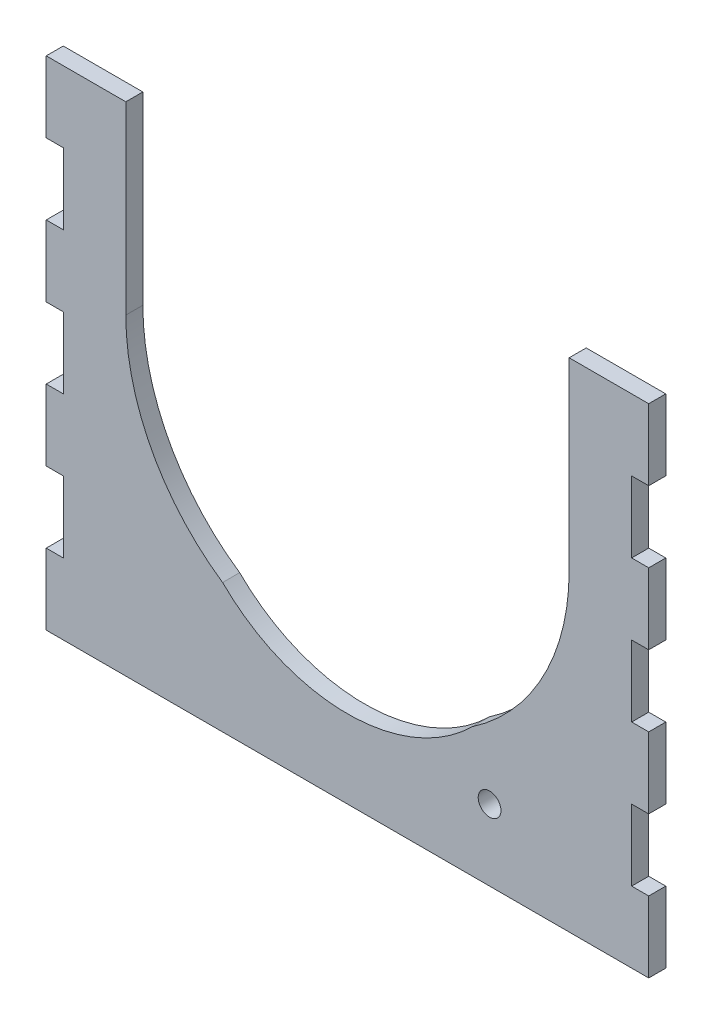
ISO-10303-21;
HEADER;
FILE_DESCRIPTION(('STEP AP214'),'2;1');
FILE_NAME('part.step','',(''),(''),'','','');
FILE_SCHEMA(('AUTOMOTIVE_DESIGN { 1 0 10303 214 1 1 1 1 }'));
ENDSEC;
DATA;
#1=APPLICATION_CONTEXT('core data for automotive mechanical design processes');
#2=APPLICATION_PROTOCOL_DEFINITION('international standard','automotive_design',2000,#1);
#3=PRODUCT_CONTEXT('',#1,'mechanical');
#4=PRODUCT('Part','Part','',(#3));
#5=PRODUCT_RELATED_PRODUCT_CATEGORY('part','',(#4));
#6=PRODUCT_DEFINITION_FORMATION('','',#4);
#7=PRODUCT_DEFINITION_CONTEXT('part definition',#1,'design');
#8=PRODUCT_DEFINITION('design','',#6,#7);
#9=PRODUCT_DEFINITION_SHAPE('','',#8);
#10=(LENGTH_UNIT() NAMED_UNIT(*) SI_UNIT(.MILLI.,.METRE.));
#11=(NAMED_UNIT(*) PLANE_ANGLE_UNIT() SI_UNIT($,.RADIAN.));
#12=(NAMED_UNIT(*) SI_UNIT($,.STERADIAN.) SOLID_ANGLE_UNIT());
#13=UNCERTAINTY_MEASURE_WITH_UNIT(LENGTH_MEASURE(1.E-05),#10,'distance_accuracy_value','');
#14=(GEOMETRIC_REPRESENTATION_CONTEXT(3) GLOBAL_UNCERTAINTY_ASSIGNED_CONTEXT((#13)) GLOBAL_UNIT_ASSIGNED_CONTEXT((#10,
#11,#12)) REPRESENTATION_CONTEXT('',''));
#15=CARTESIAN_POINT('',(0.,0.,0.));
#16=DIRECTION('',(0.,0.,1.));
#17=DIRECTION('',(1.,0.,0.));
#18=AXIS2_PLACEMENT_3D('',#15,#16,#17);
#19=CARTESIAN_POINT('',(0.,0.,6.));
#20=DIRECTION('',(-1.,0.,0.));
#21=DIRECTION('',(0.,0.,1.));
#22=AXIS2_PLACEMENT_3D('',#19,#20,#21);
#23=PLANE('',#22);
#24=DIRECTION('',(0.,1.,0.));
#25=VECTOR('',#24,1.);
#26=CARTESIAN_POINT('',(0.,0.,6.));
#27=LINE('',#26,#25);
#28=CARTESIAN_POINT('',(0.,24.9999999999999,6.));
#29=VERTEX_POINT('',#28);
#30=CARTESIAN_POINT('',(0.,50.,6.));
#31=VERTEX_POINT('',#30);
#32=EDGE_CURVE('E61',#29,#31,#27,.T.);
#33=ORIENTED_EDGE('',*,*,#32,.F.);
#34=DIRECTION('',(0.,0.,1.));
#35=VECTOR('',#34,1.);
#36=CARTESIAN_POINT('',(0.,24.9999999999999,0.));
#37=LINE('',#36,#35);
#38=CARTESIAN_POINT('',(0.,24.9999999999999,0.));
#39=VERTEX_POINT('',#38);
#40=EDGE_CURVE('E279',#39,#29,#37,.T.);
#41=ORIENTED_EDGE('',*,*,#40,.F.);
#42=DIRECTION('',(0.,1.,0.));
#43=VECTOR('',#42,1.);
#44=CARTESIAN_POINT('',(0.,0.,0.));
#45=LINE('',#44,#43);
#46=CARTESIAN_POINT('',(0.,50.,0.));
#47=VERTEX_POINT('',#46);
#48=EDGE_CURVE('E286',#39,#47,#45,.T.);
#49=ORIENTED_EDGE('',*,*,#48,.T.);
#50=DIRECTION('',(0.,0.,1.));
#51=VECTOR('',#50,1.);
#52=CARTESIAN_POINT('',(0.,50.,0.));
#53=LINE('',#52,#51);
#54=EDGE_CURVE('E363',#47,#31,#53,.T.);
#55=ORIENTED_EDGE('',*,*,#54,.T.);
#56=EDGE_LOOP('',(#33,#41,#49,#55));
#57=FACE_BOUND('',#56,.T.);
#58=ADVANCED_FACE('F45',(#57),#23,.F.);
#59=CARTESIAN_POINT('',(-200.,0.,6.));
#60=DIRECTION('',(1.,0.,0.));
#61=DIRECTION('',(0.,1.,0.));
#62=AXIS2_PLACEMENT_3D('',#59,#60,#61);
#63=PLANE('',#62);
#64=DIRECTION('',(0.,-1.,0.));
#65=VECTOR('',#64,1.);
#66=CARTESIAN_POINT('',(-200.,0.,0.));
#67=LINE('',#66,#65);
#68=CARTESIAN_POINT('',(-200.,50.,0.));
#69=VERTEX_POINT('',#68);
#70=CARTESIAN_POINT('',(-200.,24.9999999999999,0.));
#71=VERTEX_POINT('',#70);
#72=EDGE_CURVE('E597',#69,#71,#67,.T.);
#73=ORIENTED_EDGE('',*,*,#72,.T.);
#74=DIRECTION('',(0.,0.,1.));
#75=VECTOR('',#74,1.);
#76=CARTESIAN_POINT('',(-200.,24.9999999999999,0.));
#77=LINE('',#76,#75);
#78=CARTESIAN_POINT('',(-200.,24.9999999999999,6.));
#79=VERTEX_POINT('',#78);
#80=EDGE_CURVE('E69',#71,#79,#77,.T.);
#81=ORIENTED_EDGE('',*,*,#80,.T.);
#82=DIRECTION('',(0.,-1.,0.));
#83=VECTOR('',#82,1.);
#84=CARTESIAN_POINT('',(-200.,0.,6.));
#85=LINE('',#84,#83);
#86=CARTESIAN_POINT('',(-200.,50.,6.));
#87=VERTEX_POINT('',#86);
#88=EDGE_CURVE('E563',#87,#79,#85,.T.);
#89=ORIENTED_EDGE('',*,*,#88,.F.);
#90=DIRECTION('',(0.,0.,1.));
#91=VECTOR('',#90,1.);
#92=CARTESIAN_POINT('',(-200.,50.,0.));
#93=LINE('',#92,#91);
#94=EDGE_CURVE('E396',#69,#87,#93,.T.);
#95=ORIENTED_EDGE('',*,*,#94,.F.);
#96=EDGE_LOOP('',(#73,#81,#89,#95));
#97=FACE_BOUND('',#96,.T.);
#98=ADVANCED_FACE('F695',(#97),#63,.F.);
#99=CARTESIAN_POINT('',(0.,75.,6.));
#100=VERTEX_POINT('',#99);
#101=CARTESIAN_POINT('',(0.,100.,6.));
#102=VERTEX_POINT('',#101);
#103=EDGE_CURVE('E541',#100,#102,#27,.T.);
#104=ORIENTED_EDGE('',*,*,#103,.F.);
#105=DIRECTION('',(0.,0.,1.));
#106=VECTOR('',#105,1.);
#107=CARTESIAN_POINT('',(0.,75.,0.));
#108=LINE('',#107,#106);
#109=CARTESIAN_POINT('',(0.,75.,0.));
#110=VERTEX_POINT('',#109);
#111=EDGE_CURVE('E366',#110,#100,#108,.T.);
#112=ORIENTED_EDGE('',*,*,#111,.F.);
#113=CARTESIAN_POINT('',(0.,100.,0.));
#114=VERTEX_POINT('',#113);
#115=EDGE_CURVE('E576',#110,#114,#45,.T.);
#116=ORIENTED_EDGE('',*,*,#115,.T.);
#117=DIRECTION('',(0.,0.,1.));
#118=VECTOR('',#117,1.);
#119=CARTESIAN_POINT('',(0.,100.,0.));
#120=LINE('',#119,#118);
#121=EDGE_CURVE('E437',#114,#102,#120,.T.);
#122=ORIENTED_EDGE('',*,*,#121,.T.);
#123=EDGE_LOOP('',(#104,#112,#116,#122));
#124=FACE_BOUND('',#123,.T.);
#125=ADVANCED_FACE('F666',(#124),#23,.F.);
#126=CARTESIAN_POINT('',(-200.,100.,0.));
#127=VERTEX_POINT('',#126);
#128=CARTESIAN_POINT('',(-200.,75.,0.));
#129=VERTEX_POINT('',#128);
#130=EDGE_CURVE('E602',#127,#129,#67,.T.);
#131=ORIENTED_EDGE('',*,*,#130,.T.);
#132=DIRECTION('',(0.,0.,1.));
#133=VECTOR('',#132,1.);
#134=CARTESIAN_POINT('',(-200.,75.,0.));
#135=LINE('',#134,#133);
#136=CARTESIAN_POINT('',(-200.,75.,6.));
#137=VERTEX_POINT('',#136);
#138=EDGE_CURVE('E385',#129,#137,#135,.T.);
#139=ORIENTED_EDGE('',*,*,#138,.T.);
#140=CARTESIAN_POINT('',(-200.,100.,6.));
#141=VERTEX_POINT('',#140);
#142=EDGE_CURVE('E569',#141,#137,#85,.T.);
#143=ORIENTED_EDGE('',*,*,#142,.F.);
#144=DIRECTION('',(0.,0.,1.));
#145=VECTOR('',#144,1.);
#146=CARTESIAN_POINT('',(-200.,100.,0.));
#147=LINE('',#146,#145);
#148=EDGE_CURVE('E471',#127,#141,#147,.T.);
#149=ORIENTED_EDGE('',*,*,#148,.F.);
#150=EDGE_LOOP('',(#131,#139,#143,#149));
#151=FACE_BOUND('',#150,.T.);
#152=ADVANCED_FACE('F700',(#151),#63,.F.);
#153=CARTESIAN_POINT('',(-200.,150.,0.));
#154=VERTEX_POINT('',#153);
#155=CARTESIAN_POINT('',(-200.,125.,0.));
#156=VERTEX_POINT('',#155);
#157=EDGE_CURVE('E598',#154,#156,#67,.T.);
#158=ORIENTED_EDGE('',*,*,#157,.T.);
#159=DIRECTION('',(0.,0.,1.));
#160=VECTOR('',#159,1.);
#161=CARTESIAN_POINT('',(-200.,125.,0.));
#162=LINE('',#161,#160);
#163=CARTESIAN_POINT('',(-200.,125.,6.));
#164=VERTEX_POINT('',#163);
#165=EDGE_CURVE('E460',#156,#164,#162,.T.);
#166=ORIENTED_EDGE('',*,*,#165,.T.);
#167=CARTESIAN_POINT('',(-200.,150.,6.));
#168=VERTEX_POINT('',#167);
#169=EDGE_CURVE('E564',#168,#164,#85,.T.);
#170=ORIENTED_EDGE('',*,*,#169,.F.);
#171=DIRECTION('',(0.,0.,1.));
#172=VECTOR('',#171,1.);
#173=CARTESIAN_POINT('',(-200.,150.,0.));
#174=LINE('',#173,#172);
#175=EDGE_CURVE('E527',#154,#168,#174,.T.);
#176=ORIENTED_EDGE('',*,*,#175,.F.);
#177=EDGE_LOOP('',(#158,#166,#170,#176));
#178=FACE_BOUND('',#177,.T.);
#179=ADVANCED_FACE('F701',(#178),#63,.F.);
#180=CARTESIAN_POINT('',(0.,125.,6.));
#181=VERTEX_POINT('',#180);
#182=CARTESIAN_POINT('',(0.,150.,6.));
#183=VERTEX_POINT('',#182);
#184=EDGE_CURVE('E542',#181,#183,#27,.T.);
#185=ORIENTED_EDGE('',*,*,#184,.F.);
#186=DIRECTION('',(0.,0.,1.));
#187=VECTOR('',#186,1.);
#188=CARTESIAN_POINT('',(0.,125.,0.));
#189=LINE('',#188,#187);
#190=CARTESIAN_POINT('',(0.,125.,0.));
#191=VERTEX_POINT('',#190);
#192=EDGE_CURVE('E441',#191,#181,#189,.T.);
#193=ORIENTED_EDGE('',*,*,#192,.F.);
#194=CARTESIAN_POINT('',(0.,150.,0.));
#195=VERTEX_POINT('',#194);
#196=EDGE_CURVE('E531',#191,#195,#45,.T.);
#197=ORIENTED_EDGE('',*,*,#196,.T.);
#198=DIRECTION('',(0.,0.,1.));
#199=VECTOR('',#198,1.);
#200=CARTESIAN_POINT('',(0.,150.,0.));
#201=LINE('',#200,#199);
#202=EDGE_CURVE('E504',#195,#183,#201,.T.);
#203=ORIENTED_EDGE('',*,*,#202,.T.);
#204=EDGE_LOOP('',(#185,#193,#197,#203));
#205=FACE_BOUND('',#204,.T.);
#206=ADVANCED_FACE('F47',(#205),#23,.F.);
#207=CARTESIAN_POINT('',(0.,175.,6.));
#208=DIRECTION('',(0.,-1.,0.));
#209=DIRECTION('',(0.,0.,-1.));
#210=AXIS2_PLACEMENT_3D('',#207,#208,#209);
#211=PLANE('',#210);
#212=DIRECTION('',(-1.,0.,0.));
#213=VECTOR('',#212,1.);
#214=CARTESIAN_POINT('',(0.,175.,0.));
#215=LINE('',#214,#213);
#216=CARTESIAN_POINT('',(5.99999999999995,175.,0.));
#217=VERTEX_POINT('',#216);
#218=CARTESIAN_POINT('',(-22.,175.,0.));
#219=VERTEX_POINT('',#218);
#220=EDGE_CURVE('E575',#217,#219,#215,.T.);
#221=ORIENTED_EDGE('',*,*,#220,.T.);
#222=DIRECTION('',(0.,0.,-1.));
#223=VECTOR('',#222,1.);
#224=CARTESIAN_POINT('',(-22.,175.,6.));
#225=LINE('',#224,#223);
#226=CARTESIAN_POINT('',(-22.,175.,6.));
#227=VERTEX_POINT('',#226);
#228=EDGE_CURVE('E11',#227,#219,#225,.T.);
#229=ORIENTED_EDGE('',*,*,#228,.F.);
#230=DIRECTION('',(-1.,0.,0.));
#231=VECTOR('',#230,1.);
#232=CARTESIAN_POINT('',(0.,175.,6.));
#233=LINE('',#232,#231);
#234=CARTESIAN_POINT('',(5.99999999999995,175.,6.));
#235=VERTEX_POINT('',#234);
#236=EDGE_CURVE('E540',#235,#227,#233,.T.);
#237=ORIENTED_EDGE('',*,*,#236,.F.);
#238=DIRECTION('',(0.,0.,1.));
#239=VECTOR('',#238,1.);
#240=CARTESIAN_POINT('',(5.99999999999995,175.,0.));
#241=LINE('',#240,#239);
#242=EDGE_CURVE('E493',#217,#235,#241,.T.);
#243=ORIENTED_EDGE('',*,*,#242,.F.);
#244=EDGE_LOOP('',(#221,#229,#237,#243));
#245=FACE_BOUND('',#244,.T.);
#246=ADVANCED_FACE('F648',(#245),#211,.F.);
#247=CARTESIAN_POINT('',(-22.,110.,6.));
#248=DIRECTION('',(1.,0.,0.));
#249=DIRECTION('',(0.,0.,-1.));
#250=AXIS2_PLACEMENT_3D('',#247,#248,#249);
#251=PLANE('',#250);
#252=DIRECTION('',(0.,-1.,0.));
#253=VECTOR('',#252,1.);
#254=CARTESIAN_POINT('',(-22.,110.,0.));
#255=LINE('',#254,#253);
#256=CARTESIAN_POINT('',(-22.,110.,0.));
#257=VERTEX_POINT('',#256);
#258=EDGE_CURVE('E579',#219,#257,#255,.T.);
#259=ORIENTED_EDGE('',*,*,#258,.T.);
#260=DIRECTION('',(0.,0.,-1.));
#261=VECTOR('',#260,1.);
#262=CARTESIAN_POINT('',(-22.,110.,6.));
#263=LINE('',#262,#261);
#264=CARTESIAN_POINT('',(-22.,110.,6.));
#265=VERTEX_POINT('',#264);
#266=EDGE_CURVE('E54',#265,#257,#263,.T.);
#267=ORIENTED_EDGE('',*,*,#266,.F.);
#268=DIRECTION('',(0.,-1.,0.));
#269=VECTOR('',#268,1.);
#270=CARTESIAN_POINT('',(-22.,110.,6.));
#271=LINE('',#270,#269);
#272=EDGE_CURVE('E545',#227,#265,#271,.T.);
#273=ORIENTED_EDGE('',*,*,#272,.F.);
#274=ORIENTED_EDGE('',*,*,#228,.T.);
#275=EDGE_LOOP('',(#259,#267,#273,#274));
#276=FACE_BOUND('',#275,.T.);
#277=ADVANCED_FACE('F646',(#276),#251,.F.);
#278=CARTESIAN_POINT('',(-100.,110.,6.));
#279=DIRECTION('',(0.,0.,-1.));
#280=DIRECTION('',(-1.,0.,0.));
#281=AXIS2_PLACEMENT_3D('',#278,#279,#280);
#282=CYLINDRICAL_SURFACE('',#281,78.);
#283=CARTESIAN_POINT('',(-100.,110.,0.));
#284=DIRECTION('',(0.,0.,-1.));
#285=DIRECTION('',(1.,0.,0.));
#286=AXIS2_PLACEMENT_3D('',#283,#284,#285);
#287=CIRCLE('',#286,78.);
#288=CARTESIAN_POINT('',(-56.0568198017314,45.55625,0.));
#289=VERTEX_POINT('',#288);
#290=EDGE_CURVE('E582',#257,#289,#287,.T.);
#291=ORIENTED_EDGE('',*,*,#290,.T.);
#292=DIRECTION('',(0.,0.,-1.));
#293=VECTOR('',#292,1.);
#294=CARTESIAN_POINT('',(-56.0568198017314,45.55625,6.));
#295=LINE('',#294,#293);
#296=CARTESIAN_POINT('',(-56.0568198017314,45.55625,6.));
#297=VERTEX_POINT('',#296);
#298=EDGE_CURVE('E616',#297,#289,#295,.T.);
#299=ORIENTED_EDGE('',*,*,#298,.F.);
#300=CARTESIAN_POINT('',(-100.,110.,6.));
#301=DIRECTION('',(0.,0.,-1.));
#302=DIRECTION('',(1.,0.,0.));
#303=AXIS2_PLACEMENT_3D('',#300,#301,#302);
#304=CIRCLE('',#303,78.);
#305=EDGE_CURVE('E548',#265,#297,#304,.T.);
#306=ORIENTED_EDGE('',*,*,#305,.F.);
#307=ORIENTED_EDGE('',*,*,#266,.T.);
#308=EDGE_LOOP('',(#291,#299,#306,#307));
#309=FACE_BOUND('',#308,.T.);
#310=ADVANCED_FACE('F625',(#309),#282,.F.);
#311=CARTESIAN_POINT('',(-100.,90.,6.));
#312=DIRECTION('',(0.,0.,-1.));
#313=DIRECTION('',(-1.,0.,0.));
#314=AXIS2_PLACEMENT_3D('',#311,#312,#313);
#315=CYLINDRICAL_SURFACE('',#314,62.5);
#316=CARTESIAN_POINT('',(-100.,90.,0.));
#317=DIRECTION('',(0.,0.,-1.));
#318=DIRECTION('',(1.,0.,0.));
#319=AXIS2_PLACEMENT_3D('',#316,#317,#318);
#320=CIRCLE('',#319,62.5);
#321=CARTESIAN_POINT('',(-143.943180198269,45.55625,0.));
#322=VERTEX_POINT('',#321);
#323=EDGE_CURVE('E585',#289,#322,#320,.T.);
#324=ORIENTED_EDGE('',*,*,#323,.T.);
#325=DIRECTION('',(0.,0.,-1.));
#326=VECTOR('',#325,1.);
#327=CARTESIAN_POINT('',(-143.943180198269,45.55625,6.));
#328=LINE('',#327,#326);
#329=CARTESIAN_POINT('',(-143.943180198269,45.55625,6.));
#330=VERTEX_POINT('',#329);
#331=EDGE_CURVE('E612',#330,#322,#328,.T.);
#332=ORIENTED_EDGE('',*,*,#331,.F.);
#333=CARTESIAN_POINT('',(-100.,90.,6.));
#334=DIRECTION('',(0.,0.,-1.));
#335=DIRECTION('',(1.,0.,0.));
#336=AXIS2_PLACEMENT_3D('',#333,#334,#335);
#337=CIRCLE('',#336,62.5);
#338=EDGE_CURVE('E551',#297,#330,#337,.T.);
#339=ORIENTED_EDGE('',*,*,#338,.F.);
#340=ORIENTED_EDGE('',*,*,#298,.T.);
#341=EDGE_LOOP('',(#324,#332,#339,#340));
#342=FACE_BOUND('',#341,.T.);
#343=ADVANCED_FACE('F635',(#342),#315,.F.);
#344=CARTESIAN_POINT('',(-100.,110.,6.));
#345=DIRECTION('',(0.,0.,-1.));
#346=DIRECTION('',(-1.,0.,0.));
#347=AXIS2_PLACEMENT_3D('',#344,#345,#346);
#348=CYLINDRICAL_SURFACE('',#347,78.);
#349=CARTESIAN_POINT('',(-100.,110.,0.));
#350=DIRECTION('',(0.,0.,-1.));
#351=DIRECTION('',(1.,0.,0.));
#352=AXIS2_PLACEMENT_3D('',#349,#350,#351);
#353=CIRCLE('',#352,78.);
#354=CARTESIAN_POINT('',(-178.,110.,0.));
#355=VERTEX_POINT('',#354);
#356=EDGE_CURVE('E588',#322,#355,#353,.T.);
#357=ORIENTED_EDGE('',*,*,#356,.T.);
#358=DIRECTION('',(0.,0.,-1.));
#359=VECTOR('',#358,1.);
#360=CARTESIAN_POINT('',(-178.,110.,6.));
#361=LINE('',#360,#359);
#362=CARTESIAN_POINT('',(-178.,110.,6.));
#363=VERTEX_POINT('',#362);
#364=EDGE_CURVE('E608',#363,#355,#361,.T.);
#365=ORIENTED_EDGE('',*,*,#364,.F.);
#366=CARTESIAN_POINT('',(-100.,110.,6.));
#367=DIRECTION('',(0.,0.,-1.));
#368=DIRECTION('',(1.,0.,0.));
#369=AXIS2_PLACEMENT_3D('',#366,#367,#368);
#370=CIRCLE('',#369,78.);
#371=EDGE_CURVE('E554',#330,#363,#370,.T.);
#372=ORIENTED_EDGE('',*,*,#371,.F.);
#373=ORIENTED_EDGE('',*,*,#331,.T.);
#374=EDGE_LOOP('',(#357,#365,#372,#373));
#375=FACE_BOUND('',#374,.T.);
#376=ADVANCED_FACE('F639',(#375),#348,.F.);
#377=CARTESIAN_POINT('',(-178.,110.,6.));
#378=DIRECTION('',(-1.,0.,0.));
#379=DIRECTION('',(0.,-1.,0.));
#380=AXIS2_PLACEMENT_3D('',#377,#378,#379);
#381=PLANE('',#380);
#382=DIRECTION('',(0.,1.,0.));
#383=VECTOR('',#382,1.);
#384=CARTESIAN_POINT('',(-178.,110.,0.));
#385=LINE('',#384,#383);
#386=CARTESIAN_POINT('',(-178.,175.,0.));
#387=VERTEX_POINT('',#386);
#388=EDGE_CURVE('E591',#355,#387,#385,.T.);
#389=ORIENTED_EDGE('',*,*,#388,.T.);
#390=DIRECTION('',(0.,0.,-1.));
#391=VECTOR('',#390,1.);
#392=CARTESIAN_POINT('',(-178.,175.,6.));
#393=LINE('',#392,#391);
#394=CARTESIAN_POINT('',(-178.,175.,6.));
#395=VERTEX_POINT('',#394);
#396=EDGE_CURVE('E572',#395,#387,#393,.T.);
#397=ORIENTED_EDGE('',*,*,#396,.F.);
#398=DIRECTION('',(0.,1.,0.));
#399=VECTOR('',#398,1.);
#400=CARTESIAN_POINT('',(-178.,110.,6.));
#401=LINE('',#400,#399);
#402=EDGE_CURVE('E557',#363,#395,#401,.T.);
#403=ORIENTED_EDGE('',*,*,#402,.F.);
#404=ORIENTED_EDGE('',*,*,#364,.T.);
#405=EDGE_LOOP('',(#389,#397,#403,#404));
#406=FACE_BOUND('',#405,.T.);
#407=ADVANCED_FACE('F720',(#406),#381,.F.);
#408=CARTESIAN_POINT('',(-178.,175.,6.));
#409=DIRECTION('',(0.,-1.,0.));
#410=DIRECTION('',(0.,0.,-1.));
#411=AXIS2_PLACEMENT_3D('',#408,#409,#410);
#412=PLANE('',#411);
#413=DIRECTION('',(-1.,0.,0.));
#414=VECTOR('',#413,1.);
#415=CARTESIAN_POINT('',(-178.,175.,0.));
#416=LINE('',#415,#414);
#417=CARTESIAN_POINT('',(-206.,175.,0.));
#418=VERTEX_POINT('',#417);
#419=EDGE_CURVE('E594',#387,#418,#416,.T.);
#420=ORIENTED_EDGE('',*,*,#419,.T.);
#421=DIRECTION('',(0.,0.,1.));
#422=VECTOR('',#421,1.);
#423=CARTESIAN_POINT('',(-206.,175.,0.));
#424=LINE('',#423,#422);
#425=CARTESIAN_POINT('',(-206.,175.,6.));
#426=VERTEX_POINT('',#425);
#427=EDGE_CURVE('E520',#418,#426,#424,.T.);
#428=ORIENTED_EDGE('',*,*,#427,.T.);
#429=DIRECTION('',(-1.,0.,0.));
#430=VECTOR('',#429,1.);
#431=CARTESIAN_POINT('',(-178.,175.,6.));
#432=LINE('',#431,#430);
#433=EDGE_CURVE('E560',#395,#426,#432,.T.);
#434=ORIENTED_EDGE('',*,*,#433,.F.);
#435=ORIENTED_EDGE('',*,*,#396,.T.);
#436=EDGE_LOOP('',(#420,#428,#434,#435));
#437=FACE_BOUND('',#436,.T.);
#438=ADVANCED_FACE('F717',(#437),#412,.F.);
#439=CARTESIAN_POINT('',(0.,0.,6.));
#440=DIRECTION('',(0.,1.,0.));
#441=DIRECTION('',(-1.,0.,0.));
#442=AXIS2_PLACEMENT_3D('',#439,#440,#441);
#443=PLANE('',#442);
#444=DIRECTION('',(1.,0.,0.));
#445=VECTOR('',#444,1.);
#446=CARTESIAN_POINT('',(0.,0.,0.));
#447=LINE('',#446,#445);
#448=CARTESIAN_POINT('',(-206.,0.,0.));
#449=VERTEX_POINT('',#448);
#450=CARTESIAN_POINT('',(6.00000000000001,0.,0.));
#451=VERTEX_POINT('',#450);
#452=EDGE_CURVE('E601',#449,#451,#447,.T.);
#453=ORIENTED_EDGE('',*,*,#452,.T.);
#454=DIRECTION('',(0.,0.,1.));
#455=VECTOR('',#454,1.);
#456=CARTESIAN_POINT('',(6.00000000000001,0.,0.));
#457=LINE('',#456,#455);
#458=CARTESIAN_POINT('',(6.00000000000001,0.,6.));
#459=VERTEX_POINT('',#458);
#460=EDGE_CURVE('E292',#451,#459,#457,.T.);
#461=ORIENTED_EDGE('',*,*,#460,.T.);
#462=DIRECTION('',(1.,0.,0.));
#463=VECTOR('',#462,1.);
#464=CARTESIAN_POINT('',(0.,0.,6.));
#465=LINE('',#464,#463);
#466=CARTESIAN_POINT('',(-206.,0.,6.));
#467=VERTEX_POINT('',#466);
#468=EDGE_CURVE('E568',#467,#459,#465,.T.);
#469=ORIENTED_EDGE('',*,*,#468,.F.);
#470=DIRECTION('',(0.,0.,1.));
#471=VECTOR('',#470,1.);
#472=CARTESIAN_POINT('',(-206.,0.,0.));
#473=LINE('',#472,#471);
#474=EDGE_CURVE('E325',#449,#467,#473,.T.);
#475=ORIENTED_EDGE('',*,*,#474,.F.);
#476=EDGE_LOOP('',(#453,#461,#469,#475));
#477=FACE_BOUND('',#476,.T.);
#478=ADVANCED_FACE('F715',(#477),#443,.F.);
#479=CARTESIAN_POINT('',(-100.,110.,6.));
#480=DIRECTION('',(0.,0.,1.));
#481=DIRECTION('',(1.,0.,0.));
#482=AXIS2_PLACEMENT_3D('',#479,#480,#481);
#483=PLANE('',#482);
#484=CARTESIAN_POINT('',(-50.,24.9999999999999,6.));
#485=DIRECTION('',(0.,0.,1.));
#486=DIRECTION('',(1.,0.,0.));
#487=AXIS2_PLACEMENT_3D('',#484,#485,#486);
#488=CIRCLE('',#487,4.00000000000001);
#489=CARTESIAN_POINT('',(-46.,24.9999999999999,6.));
#490=VERTEX_POINT('',#489);
#491=EDGE_CURVE('E299',#490,#490,#488,.T.);
#492=ORIENTED_EDGE('',*,*,#491,.F.);
#493=EDGE_LOOP('',(#492));
#494=FACE_BOUND('',#493,.T.);
#495=ORIENTED_EDGE('',*,*,#468,.T.);
#496=DIRECTION('',(0.,1.,0.));
#497=VECTOR('',#496,1.);
#498=CARTESIAN_POINT('',(6.00000000000001,24.9999999999999,6.));
#499=LINE('',#498,#497);
#500=CARTESIAN_POINT('',(6.00000000000001,24.9999999999999,6.));
#501=VERTEX_POINT('',#500);
#502=EDGE_CURVE('E296',#459,#501,#499,.T.);
#503=ORIENTED_EDGE('',*,*,#502,.T.);
#504=DIRECTION('',(-1.,0.,0.));
#505=VECTOR('',#504,1.);
#506=CARTESIAN_POINT('',(6.00000000000001,24.9999999999999,6.));
#507=LINE('',#506,#505);
#508=EDGE_CURVE('E273',#501,#29,#507,.T.);
#509=ORIENTED_EDGE('',*,*,#508,.T.);
#510=ORIENTED_EDGE('',*,*,#32,.T.);
#511=DIRECTION('',(1.,0.,0.));
#512=VECTOR('',#511,1.);
#513=CARTESIAN_POINT('',(5.99999999999998,50.,6.));
#514=LINE('',#513,#512);
#515=CARTESIAN_POINT('',(5.99999999999998,50.,6.));
#516=VERTEX_POINT('',#515);
#517=EDGE_CURVE('E340',#31,#516,#514,.T.);
#518=ORIENTED_EDGE('',*,*,#517,.T.);
#519=DIRECTION('',(0.,1.,0.));
#520=VECTOR('',#519,1.);
#521=CARTESIAN_POINT('',(5.99999999999998,75.,6.));
#522=LINE('',#521,#520);
#523=CARTESIAN_POINT('',(5.99999999999998,75.,6.));
#524=VERTEX_POINT('',#523);
#525=EDGE_CURVE('E329',#516,#524,#522,.T.);
#526=ORIENTED_EDGE('',*,*,#525,.T.);
#527=DIRECTION('',(-1.,0.,0.));
#528=VECTOR('',#527,1.);
#529=CARTESIAN_POINT('',(5.99999999999998,75.,6.));
#530=LINE('',#529,#528);
#531=EDGE_CURVE('E352',#524,#100,#530,.T.);
#532=ORIENTED_EDGE('',*,*,#531,.T.);
#533=ORIENTED_EDGE('',*,*,#103,.T.);
#534=DIRECTION('',(1.,0.,0.));
#535=VECTOR('',#534,1.);
#536=CARTESIAN_POINT('',(5.99999999999998,100.,6.));
#537=LINE('',#536,#535);
#538=CARTESIAN_POINT('',(5.99999999999998,100.,6.));
#539=VERTEX_POINT('',#538);
#540=EDGE_CURVE('E414',#102,#539,#537,.T.);
#541=ORIENTED_EDGE('',*,*,#540,.T.);
#542=DIRECTION('',(0.,1.,0.));
#543=VECTOR('',#542,1.);
#544=CARTESIAN_POINT('',(5.99999999999998,125.,6.));
#545=LINE('',#544,#543);
#546=CARTESIAN_POINT('',(5.99999999999998,125.,6.));
#547=VERTEX_POINT('',#546);
#548=EDGE_CURVE('E400',#539,#547,#545,.T.);
#549=ORIENTED_EDGE('',*,*,#548,.T.);
#550=DIRECTION('',(-1.,0.,0.));
#551=VECTOR('',#550,1.);
#552=CARTESIAN_POINT('',(5.99999999999998,125.,6.));
#553=LINE('',#552,#551);
#554=EDGE_CURVE('E426',#547,#181,#553,.T.);
#555=ORIENTED_EDGE('',*,*,#554,.T.);
#556=ORIENTED_EDGE('',*,*,#184,.T.);
#557=DIRECTION('',(1.,0.,0.));
#558=VECTOR('',#557,1.);
#559=CARTESIAN_POINT('',(5.99999999999995,150.,6.));
#560=LINE('',#559,#558);
#561=CARTESIAN_POINT('',(5.99999999999995,150.,6.));
#562=VERTEX_POINT('',#561);
#563=EDGE_CURVE('E489',#183,#562,#560,.T.);
#564=ORIENTED_EDGE('',*,*,#563,.T.);
#565=DIRECTION('',(0.,1.,0.));
#566=VECTOR('',#565,1.);
#567=CARTESIAN_POINT('',(5.99999999999995,175.,6.));
#568=LINE('',#567,#566);
#569=EDGE_CURVE('E475',#562,#235,#568,.T.);
#570=ORIENTED_EDGE('',*,*,#569,.T.);
#571=ORIENTED_EDGE('',*,*,#236,.T.);
#572=ORIENTED_EDGE('',*,*,#272,.T.);
#573=ORIENTED_EDGE('',*,*,#305,.T.);
#574=ORIENTED_EDGE('',*,*,#338,.T.);
#575=ORIENTED_EDGE('',*,*,#371,.T.);
#576=ORIENTED_EDGE('',*,*,#402,.T.);
#577=ORIENTED_EDGE('',*,*,#433,.T.);
#578=DIRECTION('',(0.,-1.,0.));
#579=VECTOR('',#578,1.);
#580=CARTESIAN_POINT('',(-206.,175.,6.));
#581=LINE('',#580,#579);
#582=CARTESIAN_POINT('',(-206.,150.,6.));
#583=VERTEX_POINT('',#582);
#584=EDGE_CURVE('E503',#426,#583,#581,.T.);
#585=ORIENTED_EDGE('',*,*,#584,.T.);
#586=DIRECTION('',(1.,0.,0.));
#587=VECTOR('',#586,1.);
#588=CARTESIAN_POINT('',(-200.,150.,6.));
#589=LINE('',#588,#587);
#590=EDGE_CURVE('E516',#583,#168,#589,.T.);
#591=ORIENTED_EDGE('',*,*,#590,.T.);
#592=ORIENTED_EDGE('',*,*,#169,.T.);
#593=DIRECTION('',(-1.,0.,0.));
#594=VECTOR('',#593,1.);
#595=CARTESIAN_POINT('',(-200.,125.,6.));
#596=LINE('',#595,#594);
#597=CARTESIAN_POINT('',(-206.,125.,6.));
#598=VERTEX_POINT('',#597);
#599=EDGE_CURVE('E436',#164,#598,#596,.T.);
#600=ORIENTED_EDGE('',*,*,#599,.T.);
#601=DIRECTION('',(0.,-1.,0.));
#602=VECTOR('',#601,1.);
#603=CARTESIAN_POINT('',(-206.,125.,6.));
#604=LINE('',#603,#602);
#605=CARTESIAN_POINT('',(-206.,100.,6.));
#606=VERTEX_POINT('',#605);
#607=EDGE_CURVE('E464',#598,#606,#604,.T.);
#608=ORIENTED_EDGE('',*,*,#607,.T.);
#609=DIRECTION('',(1.,0.,0.));
#610=VECTOR('',#609,1.);
#611=CARTESIAN_POINT('',(-200.,100.,6.));
#612=LINE('',#611,#610);
#613=EDGE_CURVE('E452',#606,#141,#612,.T.);
#614=ORIENTED_EDGE('',*,*,#613,.T.);
#615=ORIENTED_EDGE('',*,*,#142,.T.);
#616=DIRECTION('',(-1.,0.,0.));
#617=VECTOR('',#616,1.);
#618=CARTESIAN_POINT('',(-200.,75.,6.));
#619=LINE('',#618,#617);
#620=CARTESIAN_POINT('',(-206.,75.,6.));
#621=VERTEX_POINT('',#620);
#622=EDGE_CURVE('E362',#137,#621,#619,.T.);
#623=ORIENTED_EDGE('',*,*,#622,.T.);
#624=DIRECTION('',(0.,-1.,0.));
#625=VECTOR('',#624,1.);
#626=CARTESIAN_POINT('',(-206.,75.,6.));
#627=LINE('',#626,#625);
#628=CARTESIAN_POINT('',(-206.,50.,6.));
#629=VERTEX_POINT('',#628);
#630=EDGE_CURVE('E389',#621,#629,#627,.T.);
#631=ORIENTED_EDGE('',*,*,#630,.T.);
#632=DIRECTION('',(1.,0.,0.));
#633=VECTOR('',#632,1.);
#634=CARTESIAN_POINT('',(-200.,50.,6.));
#635=LINE('',#634,#633);
#636=EDGE_CURVE('E377',#629,#87,#635,.T.);
#637=ORIENTED_EDGE('',*,*,#636,.T.);
#638=ORIENTED_EDGE('',*,*,#88,.T.);
#639=DIRECTION('',(-1.,0.,0.));
#640=VECTOR('',#639,1.);
#641=CARTESIAN_POINT('',(-200.,24.9999999999999,6.));
#642=LINE('',#641,#640);
#643=CARTESIAN_POINT('',(-206.,24.9999999999999,6.));
#644=VERTEX_POINT('',#643);
#645=EDGE_CURVE('E307',#79,#644,#642,.T.);
#646=ORIENTED_EDGE('',*,*,#645,.T.);
#647=DIRECTION('',(0.,-1.,0.));
#648=VECTOR('',#647,1.);
#649=CARTESIAN_POINT('',(-206.,24.9999999999999,6.));
#650=LINE('',#649,#648);
#651=EDGE_CURVE('E315',#644,#467,#650,.T.);
#652=ORIENTED_EDGE('',*,*,#651,.T.);
#653=EDGE_LOOP('',(#495,#503,#509,#510,#518,#526,#532,#533,#541,#549,#555,#556,#564,#570,#571,
#572,#573,#574,#575,#576,#577,#585,#591,#592,#600,#608,#614,#615,#623,#631,#637,#638,#646,#652));
#654=FACE_BOUND('',#653,.T.);
#655=ADVANCED_FACE('F643',(#494,#654),#483,.T.);
#656=CARTESIAN_POINT('',(-100.,110.,0.));
#657=DIRECTION('',(0.,0.,1.));
#658=DIRECTION('',(1.,0.,0.));
#659=AXIS2_PLACEMENT_3D('',#656,#657,#658);
#660=PLANE('',#659);
#661=CARTESIAN_POINT('',(-50.,24.9999999999999,0.));
#662=DIRECTION('',(0.,0.,1.));
#663=DIRECTION('',(1.,0.,0.));
#664=AXIS2_PLACEMENT_3D('',#661,#662,#663);
#665=CIRCLE('',#664,4.00000000000001);
#666=CARTESIAN_POINT('',(-46.,24.9999999999999,0.));
#667=VERTEX_POINT('',#666);
#668=EDGE_CURVE('E303',#667,#667,#665,.T.);
#669=ORIENTED_EDGE('',*,*,#668,.T.);
#670=EDGE_LOOP('',(#669));
#671=FACE_BOUND('',#670,.T.);
#672=ORIENTED_EDGE('',*,*,#48,.F.);
#673=DIRECTION('',(-1.,0.,0.));
#674=VECTOR('',#673,1.);
#675=CARTESIAN_POINT('',(6.00000000000001,24.9999999999999,0.));
#676=LINE('',#675,#674);
#677=CARTESIAN_POINT('',(6.00000000000001,24.9999999999999,0.));
#678=VERTEX_POINT('',#677);
#679=EDGE_CURVE('E271',#678,#39,#676,.T.);
#680=ORIENTED_EDGE('',*,*,#679,.F.);
#681=DIRECTION('',(0.,1.,0.));
#682=VECTOR('',#681,1.);
#683=CARTESIAN_POINT('',(6.00000000000001,24.9999999999999,0.));
#684=LINE('',#683,#682);
#685=EDGE_CURVE('E284',#451,#678,#684,.T.);
#686=ORIENTED_EDGE('',*,*,#685,.F.);
#687=ORIENTED_EDGE('',*,*,#452,.F.);
#688=DIRECTION('',(0.,-1.,0.));
#689=VECTOR('',#688,1.);
#690=CARTESIAN_POINT('',(-206.,24.9999999999999,0.));
#691=LINE('',#690,#689);
#692=CARTESIAN_POINT('',(-206.,24.9999999999999,0.));
#693=VERTEX_POINT('',#692);
#694=EDGE_CURVE('E314',#693,#449,#691,.T.);
#695=ORIENTED_EDGE('',*,*,#694,.F.);
#696=DIRECTION('',(-1.,0.,0.));
#697=VECTOR('',#696,1.);
#698=CARTESIAN_POINT('',(-200.,24.9999999999999,0.));
#699=LINE('',#698,#697);
#700=EDGE_CURVE('E310',#71,#693,#699,.T.);
#701=ORIENTED_EDGE('',*,*,#700,.F.);
#702=ORIENTED_EDGE('',*,*,#72,.F.);
#703=DIRECTION('',(1.,0.,0.));
#704=VECTOR('',#703,1.);
#705=CARTESIAN_POINT('',(-200.,50.,0.));
#706=LINE('',#705,#704);
#707=CARTESIAN_POINT('',(-206.,50.,0.));
#708=VERTEX_POINT('',#707);
#709=EDGE_CURVE('E381',#708,#69,#706,.T.);
#710=ORIENTED_EDGE('',*,*,#709,.F.);
#711=DIRECTION('',(0.,-1.,0.));
#712=VECTOR('',#711,1.);
#713=CARTESIAN_POINT('',(-206.,75.,0.));
#714=LINE('',#713,#712);
#715=CARTESIAN_POINT('',(-206.,75.,0.));
#716=VERTEX_POINT('',#715);
#717=EDGE_CURVE('E376',#716,#708,#714,.T.);
#718=ORIENTED_EDGE('',*,*,#717,.F.);
#719=DIRECTION('',(-1.,0.,0.));
#720=VECTOR('',#719,1.);
#721=CARTESIAN_POINT('',(-200.,75.,0.));
#722=LINE('',#721,#720);
#723=EDGE_CURVE('E372',#129,#716,#722,.T.);
#724=ORIENTED_EDGE('',*,*,#723,.F.);
#725=ORIENTED_EDGE('',*,*,#130,.F.);
#726=DIRECTION('',(1.,0.,0.));
#727=VECTOR('',#726,1.);
#728=CARTESIAN_POINT('',(-200.,100.,0.));
#729=LINE('',#728,#727);
#730=CARTESIAN_POINT('',(-206.,100.,0.));
#731=VERTEX_POINT('',#730);
#732=EDGE_CURVE('E456',#731,#127,#729,.T.);
#733=ORIENTED_EDGE('',*,*,#732,.F.);
#734=DIRECTION('',(0.,-1.,0.));
#735=VECTOR('',#734,1.);
#736=CARTESIAN_POINT('',(-206.,125.,0.));
#737=LINE('',#736,#735);
#738=CARTESIAN_POINT('',(-206.,125.,0.));
#739=VERTEX_POINT('',#738);
#740=EDGE_CURVE('E451',#739,#731,#737,.T.);
#741=ORIENTED_EDGE('',*,*,#740,.F.);
#742=DIRECTION('',(-1.,0.,0.));
#743=VECTOR('',#742,1.);
#744=CARTESIAN_POINT('',(-200.,125.,0.));
#745=LINE('',#744,#743);
#746=EDGE_CURVE('E447',#156,#739,#745,.T.);
#747=ORIENTED_EDGE('',*,*,#746,.F.);
#748=ORIENTED_EDGE('',*,*,#157,.F.);
#749=DIRECTION('',(1.,0.,0.));
#750=VECTOR('',#749,1.);
#751=CARTESIAN_POINT('',(-200.,150.,0.));
#752=LINE('',#751,#750);
#753=CARTESIAN_POINT('',(-206.,150.,0.));
#754=VERTEX_POINT('',#753);
#755=EDGE_CURVE('E515',#754,#154,#752,.T.);
#756=ORIENTED_EDGE('',*,*,#755,.F.);
#757=DIRECTION('',(0.,-1.,0.));
#758=VECTOR('',#757,1.);
#759=CARTESIAN_POINT('',(-206.,175.,0.));
#760=LINE('',#759,#758);
#761=EDGE_CURVE('E511',#418,#754,#760,.T.);
#762=ORIENTED_EDGE('',*,*,#761,.F.);
#763=ORIENTED_EDGE('',*,*,#419,.F.);
#764=ORIENTED_EDGE('',*,*,#388,.F.);
#765=ORIENTED_EDGE('',*,*,#356,.F.);
#766=ORIENTED_EDGE('',*,*,#323,.F.);
#767=ORIENTED_EDGE('',*,*,#290,.F.);
#768=ORIENTED_EDGE('',*,*,#258,.F.);
#769=ORIENTED_EDGE('',*,*,#220,.F.);
#770=DIRECTION('',(0.,1.,0.));
#771=VECTOR('',#770,1.);
#772=CARTESIAN_POINT('',(5.99999999999995,175.,0.));
#773=LINE('',#772,#771);
#774=CARTESIAN_POINT('',(5.99999999999995,150.,0.));
#775=VERTEX_POINT('',#774);
#776=EDGE_CURVE('E484',#775,#217,#773,.T.);
#777=ORIENTED_EDGE('',*,*,#776,.F.);
#778=DIRECTION('',(1.,0.,0.));
#779=VECTOR('',#778,1.);
#780=CARTESIAN_POINT('',(5.99999999999995,150.,0.));
#781=LINE('',#780,#779);
#782=EDGE_CURVE('E488',#195,#775,#781,.T.);
#783=ORIENTED_EDGE('',*,*,#782,.F.);
#784=ORIENTED_EDGE('',*,*,#196,.F.);
#785=DIRECTION('',(-1.,0.,0.));
#786=VECTOR('',#785,1.);
#787=CARTESIAN_POINT('',(5.99999999999998,125.,0.));
#788=LINE('',#787,#786);
#789=CARTESIAN_POINT('',(5.99999999999998,125.,0.));
#790=VERTEX_POINT('',#789);
#791=EDGE_CURVE('E413',#790,#191,#788,.T.);
#792=ORIENTED_EDGE('',*,*,#791,.F.);
#793=DIRECTION('',(0.,1.,0.));
#794=VECTOR('',#793,1.);
#795=CARTESIAN_POINT('',(5.99999999999998,125.,0.));
#796=LINE('',#795,#794);
#797=CARTESIAN_POINT('',(5.99999999999998,100.,0.));
#798=VERTEX_POINT('',#797);
#799=EDGE_CURVE('E409',#798,#790,#796,.T.);
#800=ORIENTED_EDGE('',*,*,#799,.F.);
#801=DIRECTION('',(1.,0.,0.));
#802=VECTOR('',#801,1.);
#803=CARTESIAN_POINT('',(5.99999999999998,100.,0.));
#804=LINE('',#803,#802);
#805=EDGE_CURVE('E418',#114,#798,#804,.T.);
#806=ORIENTED_EDGE('',*,*,#805,.F.);
#807=ORIENTED_EDGE('',*,*,#115,.F.);
#808=DIRECTION('',(-1.,0.,0.));
#809=VECTOR('',#808,1.);
#810=CARTESIAN_POINT('',(5.99999999999998,75.,0.));
#811=LINE('',#810,#809);
#812=CARTESIAN_POINT('',(5.99999999999998,75.,0.));
#813=VERTEX_POINT('',#812);
#814=EDGE_CURVE('E339',#813,#110,#811,.T.);
#815=ORIENTED_EDGE('',*,*,#814,.F.);
#816=DIRECTION('',(0.,1.,0.));
#817=VECTOR('',#816,1.);
#818=CARTESIAN_POINT('',(5.99999999999998,75.,0.));
#819=LINE('',#818,#817);
#820=CARTESIAN_POINT('',(5.99999999999998,50.,0.));
#821=VERTEX_POINT('',#820);
#822=EDGE_CURVE('E335',#821,#813,#819,.T.);
#823=ORIENTED_EDGE('',*,*,#822,.F.);
#824=DIRECTION('',(1.,0.,0.));
#825=VECTOR('',#824,1.);
#826=CARTESIAN_POINT('',(5.99999999999998,50.,0.));
#827=LINE('',#826,#825);
#828=EDGE_CURVE('E344',#47,#821,#827,.T.);
#829=ORIENTED_EDGE('',*,*,#828,.F.);
#830=EDGE_LOOP('',(#672,#680,#686,#687,#695,#701,#702,#710,#718,#724,#725,#733,#741,#747,#748,
#756,#762,#763,#764,#765,#766,#767,#768,#769,#777,#783,#784,#792,#800,#806,#807,#815,#823,#829));
#831=FACE_BOUND('',#830,.T.);
#832=ADVANCED_FACE('F283',(#671,#831),#660,.F.);
#833=CARTESIAN_POINT('',(-200.,150.,0.));
#834=DIRECTION('',(0.,-1.,0.));
#835=DIRECTION('',(0.,0.,-1.));
#836=AXIS2_PLACEMENT_3D('',#833,#834,#835);
#837=PLANE('',#836);
#838=ORIENTED_EDGE('',*,*,#590,.F.);
#839=DIRECTION('',(0.,0.,1.));
#840=VECTOR('',#839,1.);
#841=CARTESIAN_POINT('',(-206.,150.,0.));
#842=LINE('',#841,#840);
#843=EDGE_CURVE('E532',#754,#583,#842,.T.);
#844=ORIENTED_EDGE('',*,*,#843,.F.);
#845=ORIENTED_EDGE('',*,*,#755,.T.);
#846=ORIENTED_EDGE('',*,*,#175,.T.);
#847=EDGE_LOOP('',(#838,#844,#845,#846));
#848=FACE_BOUND('',#847,.T.);
#849=ADVANCED_FACE('F778',(#848),#837,.T.);
#850=CARTESIAN_POINT('',(-206.,175.,0.));
#851=DIRECTION('',(-1.,0.,0.));
#852=DIRECTION('',(0.,0.,1.));
#853=AXIS2_PLACEMENT_3D('',#850,#851,#852);
#854=PLANE('',#853);
#855=ORIENTED_EDGE('',*,*,#584,.F.);
#856=ORIENTED_EDGE('',*,*,#427,.F.);
#857=ORIENTED_EDGE('',*,*,#761,.T.);
#858=ORIENTED_EDGE('',*,*,#843,.T.);
#859=EDGE_LOOP('',(#855,#856,#857,#858));
#860=FACE_BOUND('',#859,.T.);
#861=ADVANCED_FACE('F785',(#860),#854,.T.);
#862=CARTESIAN_POINT('',(5.99999999999995,175.,0.));
#863=DIRECTION('',(1.,0.,0.));
#864=DIRECTION('',(0.,0.,-1.));
#865=AXIS2_PLACEMENT_3D('',#862,#863,#864);
#866=PLANE('',#865);
#867=ORIENTED_EDGE('',*,*,#569,.F.);
#868=DIRECTION('',(0.,0.,1.));
#869=VECTOR('',#868,1.);
#870=CARTESIAN_POINT('',(5.99999999999995,150.,0.));
#871=LINE('',#870,#869);
#872=EDGE_CURVE('E500',#775,#562,#871,.T.);
#873=ORIENTED_EDGE('',*,*,#872,.F.);
#874=ORIENTED_EDGE('',*,*,#776,.T.);
#875=ORIENTED_EDGE('',*,*,#242,.T.);
#876=EDGE_LOOP('',(#867,#873,#874,#875));
#877=FACE_BOUND('',#876,.T.);
#878=ADVANCED_FACE('F793',(#877),#866,.T.);
#879=CARTESIAN_POINT('',(5.99999999999995,150.,0.));
#880=DIRECTION('',(0.,-1.,0.));
#881=DIRECTION('',(0.,0.,-1.));
#882=AXIS2_PLACEMENT_3D('',#879,#880,#881);
#883=PLANE('',#882);
#884=ORIENTED_EDGE('',*,*,#563,.F.);
#885=ORIENTED_EDGE('',*,*,#202,.F.);
#886=ORIENTED_EDGE('',*,*,#782,.T.);
#887=ORIENTED_EDGE('',*,*,#872,.T.);
#888=EDGE_LOOP('',(#884,#885,#886,#887));
#889=FACE_BOUND('',#888,.T.);
#890=ADVANCED_FACE('F656',(#889),#883,.T.);
#891=CARTESIAN_POINT('',(-200.,100.,0.));
#892=DIRECTION('',(0.,-1.,0.));
#893=DIRECTION('',(0.,0.,-1.));
#894=AXIS2_PLACEMENT_3D('',#891,#892,#893);
#895=PLANE('',#894);
#896=ORIENTED_EDGE('',*,*,#613,.F.);
#897=DIRECTION('',(0.,0.,1.));
#898=VECTOR('',#897,1.);
#899=CARTESIAN_POINT('',(-206.,100.,0.));
#900=LINE('',#899,#898);
#901=EDGE_CURVE('E476',#731,#606,#900,.T.);
#902=ORIENTED_EDGE('',*,*,#901,.F.);
#903=ORIENTED_EDGE('',*,*,#732,.T.);
#904=ORIENTED_EDGE('',*,*,#148,.T.);
#905=EDGE_LOOP('',(#896,#902,#903,#904));
#906=FACE_BOUND('',#905,.T.);
#907=ADVANCED_FACE('F806',(#906),#895,.T.);
#908=CARTESIAN_POINT('',(-206.,125.,0.));
#909=DIRECTION('',(-1.,0.,0.));
#910=DIRECTION('',(0.,0.,1.));
#911=AXIS2_PLACEMENT_3D('',#908,#909,#910);
#912=PLANE('',#911);
#913=ORIENTED_EDGE('',*,*,#607,.F.);
#914=DIRECTION('',(0.,0.,1.));
#915=VECTOR('',#914,1.);
#916=CARTESIAN_POINT('',(-206.,125.,0.));
#917=LINE('',#916,#915);
#918=EDGE_CURVE('E479',#739,#598,#917,.T.);
#919=ORIENTED_EDGE('',*,*,#918,.F.);
#920=ORIENTED_EDGE('',*,*,#740,.T.);
#921=ORIENTED_EDGE('',*,*,#901,.T.);
#922=EDGE_LOOP('',(#913,#919,#920,#921));
#923=FACE_BOUND('',#922,.T.);
#924=ADVANCED_FACE('F813',(#923),#912,.T.);
#925=CARTESIAN_POINT('',(-200.,125.,0.));
#926=DIRECTION('',(0.,1.,0.));
#927=DIRECTION('',(0.,0.,1.));
#928=AXIS2_PLACEMENT_3D('',#925,#926,#927);
#929=PLANE('',#928);
#930=ORIENTED_EDGE('',*,*,#599,.F.);
#931=ORIENTED_EDGE('',*,*,#165,.F.);
#932=ORIENTED_EDGE('',*,*,#746,.T.);
#933=ORIENTED_EDGE('',*,*,#918,.T.);
#934=EDGE_LOOP('',(#930,#931,#932,#933));
#935=FACE_BOUND('',#934,.T.);
#936=ADVANCED_FACE('F821',(#935),#929,.T.);
#937=CARTESIAN_POINT('',(5.99999999999998,125.,0.));
#938=DIRECTION('',(1.,0.,0.));
#939=DIRECTION('',(0.,0.,-1.));
#940=AXIS2_PLACEMENT_3D('',#937,#938,#939);
#941=PLANE('',#940);
#942=ORIENTED_EDGE('',*,*,#548,.F.);
#943=DIRECTION('',(0.,0.,1.));
#944=VECTOR('',#943,1.);
#945=CARTESIAN_POINT('',(5.99999999999998,100.,0.));
#946=LINE('',#945,#944);
#947=EDGE_CURVE('E433',#798,#539,#946,.T.);
#948=ORIENTED_EDGE('',*,*,#947,.F.);
#949=ORIENTED_EDGE('',*,*,#799,.T.);
#950=DIRECTION('',(0.,0.,1.));
#951=VECTOR('',#950,1.);
#952=CARTESIAN_POINT('',(5.99999999999998,125.,0.));
#953=LINE('',#952,#951);
#954=EDGE_CURVE('E422',#790,#547,#953,.T.);
#955=ORIENTED_EDGE('',*,*,#954,.T.);
#956=EDGE_LOOP('',(#942,#948,#949,#955));
#957=FACE_BOUND('',#956,.T.);
#958=ADVANCED_FACE('F675',(#957),#941,.T.);
#959=CARTESIAN_POINT('',(5.99999999999998,100.,0.));
#960=DIRECTION('',(0.,-1.,0.));
#961=DIRECTION('',(0.,0.,-1.));
#962=AXIS2_PLACEMENT_3D('',#959,#960,#961);
#963=PLANE('',#962);
#964=ORIENTED_EDGE('',*,*,#540,.F.);
#965=ORIENTED_EDGE('',*,*,#121,.F.);
#966=ORIENTED_EDGE('',*,*,#805,.T.);
#967=ORIENTED_EDGE('',*,*,#947,.T.);
#968=EDGE_LOOP('',(#964,#965,#966,#967));
#969=FACE_BOUND('',#968,.T.);
#970=ADVANCED_FACE('F671',(#969),#963,.T.);
#971=CARTESIAN_POINT('',(5.99999999999998,125.,0.));
#972=DIRECTION('',(0.,1.,0.));
#973=DIRECTION('',(0.,0.,1.));
#974=AXIS2_PLACEMENT_3D('',#971,#972,#973);
#975=PLANE('',#974);
#976=ORIENTED_EDGE('',*,*,#554,.F.);
#977=ORIENTED_EDGE('',*,*,#954,.F.);
#978=ORIENTED_EDGE('',*,*,#791,.T.);
#979=ORIENTED_EDGE('',*,*,#192,.T.);
#980=EDGE_LOOP('',(#976,#977,#978,#979));
#981=FACE_BOUND('',#980,.T.);
#982=ADVANCED_FACE('F681',(#981),#975,.T.);
#983=CARTESIAN_POINT('',(-200.,50.,0.));
#984=DIRECTION('',(0.,-1.,0.));
#985=DIRECTION('',(0.,0.,-1.));
#986=AXIS2_PLACEMENT_3D('',#983,#984,#985);
#987=PLANE('',#986);
#988=ORIENTED_EDGE('',*,*,#636,.F.);
#989=DIRECTION('',(0.,0.,1.));
#990=VECTOR('',#989,1.);
#991=CARTESIAN_POINT('',(-206.,50.,0.));
#992=LINE('',#991,#990);
#993=EDGE_CURVE('E401',#708,#629,#992,.T.);
#994=ORIENTED_EDGE('',*,*,#993,.F.);
#995=ORIENTED_EDGE('',*,*,#709,.T.);
#996=ORIENTED_EDGE('',*,*,#94,.T.);
#997=EDGE_LOOP('',(#988,#994,#995,#996));
#998=FACE_BOUND('',#997,.T.);
#999=ADVANCED_FACE('F683',(#998),#987,.T.);
#1000=CARTESIAN_POINT('',(-206.,75.,0.));
#1001=DIRECTION('',(-1.,0.,0.));
#1002=DIRECTION('',(0.,0.,1.));
#1003=AXIS2_PLACEMENT_3D('',#1000,#1001,#1002);
#1004=PLANE('',#1003);
#1005=ORIENTED_EDGE('',*,*,#630,.F.);
#1006=DIRECTION('',(0.,0.,1.));
#1007=VECTOR('',#1006,1.);
#1008=CARTESIAN_POINT('',(-206.,75.,0.));
#1009=LINE('',#1008,#1007);
#1010=EDGE_CURVE('E404',#716,#621,#1009,.T.);
#1011=ORIENTED_EDGE('',*,*,#1010,.F.);
#1012=ORIENTED_EDGE('',*,*,#717,.T.);
#1013=ORIENTED_EDGE('',*,*,#993,.T.);
#1014=EDGE_LOOP('',(#1005,#1011,#1012,#1013));
#1015=FACE_BOUND('',#1014,.T.);
#1016=ADVANCED_FACE('F689',(#1015),#1004,.T.);
#1017=CARTESIAN_POINT('',(-200.,75.,0.));
#1018=DIRECTION('',(0.,1.,0.));
#1019=DIRECTION('',(0.,0.,1.));
#1020=AXIS2_PLACEMENT_3D('',#1017,#1018,#1019);
#1021=PLANE('',#1020);
#1022=ORIENTED_EDGE('',*,*,#622,.F.);
#1023=ORIENTED_EDGE('',*,*,#138,.F.);
#1024=ORIENTED_EDGE('',*,*,#723,.T.);
#1025=ORIENTED_EDGE('',*,*,#1010,.T.);
#1026=EDGE_LOOP('',(#1022,#1023,#1024,#1025));
#1027=FACE_BOUND('',#1026,.T.);
#1028=ADVANCED_FACE('F861',(#1027),#1021,.T.);
#1029=CARTESIAN_POINT('',(5.99999999999998,75.,0.));
#1030=DIRECTION('',(1.,0.,0.));
#1031=DIRECTION('',(0.,0.,-1.));
#1032=AXIS2_PLACEMENT_3D('',#1029,#1030,#1031);
#1033=PLANE('',#1032);
#1034=ORIENTED_EDGE('',*,*,#525,.F.);
#1035=DIRECTION('',(0.,0.,1.));
#1036=VECTOR('',#1035,1.);
#1037=CARTESIAN_POINT('',(5.99999999999998,50.,0.));
#1038=LINE('',#1037,#1036);
#1039=EDGE_CURVE('E359',#821,#516,#1038,.T.);
#1040=ORIENTED_EDGE('',*,*,#1039,.F.);
#1041=ORIENTED_EDGE('',*,*,#822,.T.);
#1042=DIRECTION('',(0.,0.,1.));
#1043=VECTOR('',#1042,1.);
#1044=CARTESIAN_POINT('',(5.99999999999998,75.,0.));
#1045=LINE('',#1044,#1043);
#1046=EDGE_CURVE('E348',#813,#524,#1045,.T.);
#1047=ORIENTED_EDGE('',*,*,#1046,.T.);
#1048=EDGE_LOOP('',(#1034,#1040,#1041,#1047));
#1049=FACE_BOUND('',#1048,.T.);
#1050=ADVANCED_FACE('F872',(#1049),#1033,.T.);
#1051=CARTESIAN_POINT('',(5.99999999999998,50.,0.));
#1052=DIRECTION('',(0.,-1.,0.));
#1053=DIRECTION('',(0.,0.,-1.));
#1054=AXIS2_PLACEMENT_3D('',#1051,#1052,#1053);
#1055=PLANE('',#1054);
#1056=ORIENTED_EDGE('',*,*,#517,.F.);
#1057=ORIENTED_EDGE('',*,*,#54,.F.);
#1058=ORIENTED_EDGE('',*,*,#828,.T.);
#1059=ORIENTED_EDGE('',*,*,#1039,.T.);
#1060=EDGE_LOOP('',(#1056,#1057,#1058,#1059));
#1061=FACE_BOUND('',#1060,.T.);
#1062=ADVANCED_FACE('F883',(#1061),#1055,.T.);
#1063=CARTESIAN_POINT('',(5.99999999999998,75.,0.));
#1064=DIRECTION('',(0.,1.,0.));
#1065=DIRECTION('',(0.,0.,1.));
#1066=AXIS2_PLACEMENT_3D('',#1063,#1064,#1065);
#1067=PLANE('',#1066);
#1068=ORIENTED_EDGE('',*,*,#531,.F.);
#1069=ORIENTED_EDGE('',*,*,#1046,.F.);
#1070=ORIENTED_EDGE('',*,*,#814,.T.);
#1071=ORIENTED_EDGE('',*,*,#111,.T.);
#1072=EDGE_LOOP('',(#1068,#1069,#1070,#1071));
#1073=FACE_BOUND('',#1072,.T.);
#1074=ADVANCED_FACE('F894',(#1073),#1067,.T.);
#1075=CARTESIAN_POINT('',(-206.,24.9999999999999,0.));
#1076=DIRECTION('',(-1.,0.,0.));
#1077=DIRECTION('',(0.,0.,1.));
#1078=AXIS2_PLACEMENT_3D('',#1075,#1076,#1077);
#1079=PLANE('',#1078);
#1080=ORIENTED_EDGE('',*,*,#651,.F.);
#1081=DIRECTION('',(0.,0.,1.));
#1082=VECTOR('',#1081,1.);
#1083=CARTESIAN_POINT('',(-206.,24.9999999999999,0.));
#1084=LINE('',#1083,#1082);
#1085=EDGE_CURVE('E330',#693,#644,#1084,.T.);
#1086=ORIENTED_EDGE('',*,*,#1085,.F.);
#1087=ORIENTED_EDGE('',*,*,#694,.T.);
#1088=ORIENTED_EDGE('',*,*,#474,.T.);
#1089=EDGE_LOOP('',(#1080,#1086,#1087,#1088));
#1090=FACE_BOUND('',#1089,.T.);
#1091=ADVANCED_FACE('F905',(#1090),#1079,.T.);
#1092=CARTESIAN_POINT('',(-200.,24.9999999999999,0.));
#1093=DIRECTION('',(0.,1.,0.));
#1094=DIRECTION('',(0.,0.,1.));
#1095=AXIS2_PLACEMENT_3D('',#1092,#1093,#1094);
#1096=PLANE('',#1095);
#1097=ORIENTED_EDGE('',*,*,#645,.F.);
#1098=ORIENTED_EDGE('',*,*,#80,.F.);
#1099=ORIENTED_EDGE('',*,*,#700,.T.);
#1100=ORIENTED_EDGE('',*,*,#1085,.T.);
#1101=EDGE_LOOP('',(#1097,#1098,#1099,#1100));
#1102=FACE_BOUND('',#1101,.T.);
#1103=ADVANCED_FACE('F916',(#1102),#1096,.T.);
#1104=CARTESIAN_POINT('',(6.00000000000001,24.9999999999999,0.));
#1105=DIRECTION('',(1.,0.,0.));
#1106=DIRECTION('',(0.,0.,-1.));
#1107=AXIS2_PLACEMENT_3D('',#1104,#1105,#1106);
#1108=PLANE('',#1107);
#1109=ORIENTED_EDGE('',*,*,#502,.F.);
#1110=ORIENTED_EDGE('',*,*,#460,.F.);
#1111=ORIENTED_EDGE('',*,*,#685,.T.);
#1112=DIRECTION('',(0.,0.,1.));
#1113=VECTOR('',#1112,1.);
#1114=CARTESIAN_POINT('',(6.00000000000001,24.9999999999999,0.));
#1115=LINE('',#1114,#1113);
#1116=EDGE_CURVE('E268',#678,#501,#1115,.T.);
#1117=ORIENTED_EDGE('',*,*,#1116,.T.);
#1118=EDGE_LOOP('',(#1109,#1110,#1111,#1117));
#1119=FACE_BOUND('',#1118,.T.);
#1120=ADVANCED_FACE('F290',(#1119),#1108,.T.);
#1121=CARTESIAN_POINT('',(6.00000000000001,24.9999999999999,0.));
#1122=DIRECTION('',(0.,1.,0.));
#1123=DIRECTION('',(0.,0.,1.));
#1124=AXIS2_PLACEMENT_3D('',#1121,#1122,#1123);
#1125=PLANE('',#1124);
#1126=ORIENTED_EDGE('',*,*,#508,.F.);
#1127=ORIENTED_EDGE('',*,*,#1116,.F.);
#1128=ORIENTED_EDGE('',*,*,#679,.T.);
#1129=ORIENTED_EDGE('',*,*,#40,.T.);
#1130=EDGE_LOOP('',(#1126,#1127,#1128,#1129));
#1131=FACE_BOUND('',#1130,.T.);
#1132=ADVANCED_FACE('F270',(#1131),#1125,.T.);
#1133=CARTESIAN_POINT('',(-50.,24.9999999999999,0.));
#1134=DIRECTION('',(0.,0.,1.));
#1135=DIRECTION('',(1.,0.,0.));
#1136=AXIS2_PLACEMENT_3D('',#1133,#1134,#1135);
#1137=CYLINDRICAL_SURFACE('',#1136,4.00000000000001);
#1138=ORIENTED_EDGE('',*,*,#668,.F.);
#1139=EDGE_LOOP('',(#1138));
#1140=FACE_BOUND('',#1139,.T.);
#1141=ORIENTED_EDGE('',*,*,#491,.T.);
#1142=EDGE_LOOP('',(#1141));
#1143=FACE_BOUND('',#1142,.T.);
#1144=ADVANCED_FACE('F944',(#1140,#1143),#1137,.F.);
#1145=CLOSED_SHELL('',(#58,#98,#125,#152,#179,#206,#246,#277,#310,#343,#376,#407,#438,#478,#655,
#832,#849,#861,#878,#890,#907,#924,#936,#958,#970,#982,#999,#1016,#1028,#1050,#1062,#1074,#1091,
#1103,#1120,#1132,#1144));
#1146=MANIFOLD_SOLID_BREP('B2',#1145);
#1147=ADVANCED_BREP_SHAPE_REPRESENTATION('',(#18,#1146),#14);
#1148=SHAPE_DEFINITION_REPRESENTATION(#9,#1147);
ENDSEC;
END-ISO-10303-21;
